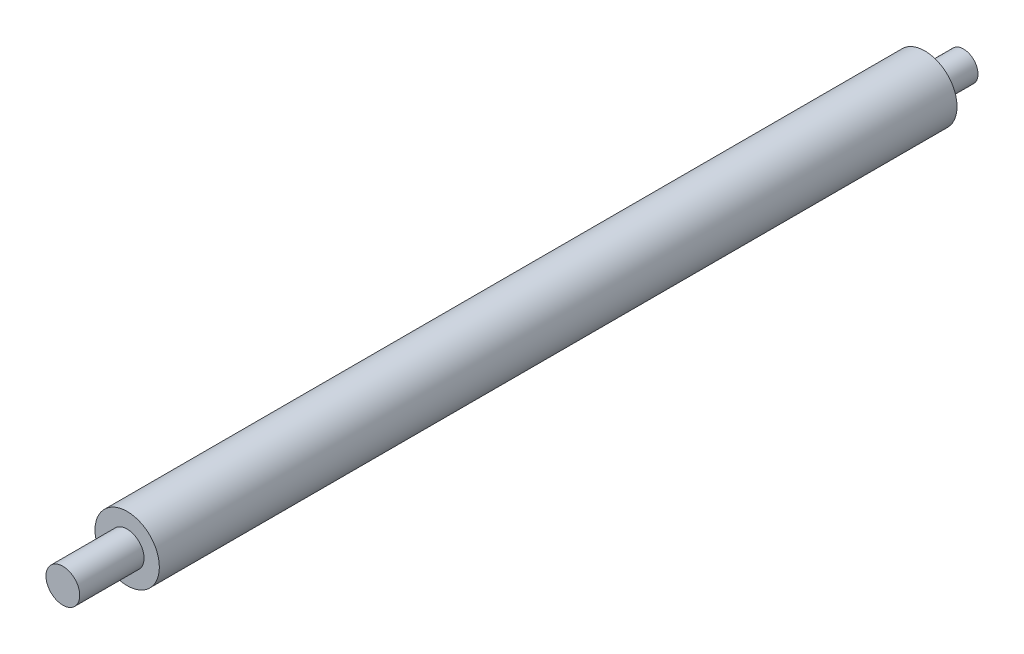
ISO-10303-21;
HEADER;
FILE_DESCRIPTION(('STEP AP214'),'2;1');
FILE_NAME('part.step','',(''),(''),'','','');
FILE_SCHEMA(('AUTOMOTIVE_DESIGN { 1 0 10303 214 1 1 1 1 }'));
ENDSEC;
DATA;
#1=APPLICATION_CONTEXT('core data for automotive mechanical design processes');
#2=APPLICATION_PROTOCOL_DEFINITION('international standard','automotive_design',2000,#1);
#3=PRODUCT_CONTEXT('',#1,'mechanical');
#4=PRODUCT('Part','Part','',(#3));
#5=PRODUCT_RELATED_PRODUCT_CATEGORY('part','',(#4));
#6=PRODUCT_DEFINITION_FORMATION('','',#4);
#7=PRODUCT_DEFINITION_CONTEXT('part definition',#1,'design');
#8=PRODUCT_DEFINITION('design','',#6,#7);
#9=PRODUCT_DEFINITION_SHAPE('','',#8);
#10=(LENGTH_UNIT() NAMED_UNIT(*) SI_UNIT(.MILLI.,.METRE.));
#11=(NAMED_UNIT(*) PLANE_ANGLE_UNIT() SI_UNIT($,.RADIAN.));
#12=(NAMED_UNIT(*) SI_UNIT($,.STERADIAN.) SOLID_ANGLE_UNIT());
#13=UNCERTAINTY_MEASURE_WITH_UNIT(LENGTH_MEASURE(1.E-05),#10,'distance_accuracy_value','');
#14=(GEOMETRIC_REPRESENTATION_CONTEXT(3) GLOBAL_UNCERTAINTY_ASSIGNED_CONTEXT((#13)) GLOBAL_UNIT_ASSIGNED_CONTEXT((#10,
#11,#12)) REPRESENTATION_CONTEXT('',''));
#15=CARTESIAN_POINT('',(0.,0.,0.));
#16=DIRECTION('',(0.,0.,1.));
#17=DIRECTION('',(1.,0.,0.));
#18=AXIS2_PLACEMENT_3D('',#15,#16,#17);
#19=CARTESIAN_POINT('',(0.,0.,700.));
#20=DIRECTION('',(0.,0.,-1.));
#21=DIRECTION('',(-1.,0.,0.));
#22=AXIS2_PLACEMENT_3D('',#19,#20,#21);
#23=CYLINDRICAL_SURFACE('',#22,25.);
#24=CARTESIAN_POINT('',(0.,0.,650.));
#25=DIRECTION('',(0.,0.,1.));
#26=DIRECTION('',(1.,0.,0.));
#27=AXIS2_PLACEMENT_3D('',#24,#25,#26);
#28=CIRCLE('',#27,25.);
#29=CARTESIAN_POINT('',(25.,0.,650.));
#30=VERTEX_POINT('',#29);
#31=EDGE_CURVE('E10',#30,#30,#28,.T.);
#32=ORIENTED_EDGE('',*,*,#31,.F.);
#33=EDGE_LOOP('',(#32));
#34=FACE_BOUND('',#33,.T.);
#35=CARTESIAN_POINT('',(0.,0.,30.));
#36=DIRECTION('',(0.,0.,-1.));
#37=DIRECTION('',(-1.,0.,0.));
#38=AXIS2_PLACEMENT_3D('',#35,#36,#37);
#39=CIRCLE('',#38,25.);
#40=CARTESIAN_POINT('',(-25.,0.,30.));
#41=VERTEX_POINT('',#40);
#42=EDGE_CURVE('E46',#41,#41,#39,.T.);
#43=ORIENTED_EDGE('',*,*,#42,.F.);
#44=EDGE_LOOP('',(#43));
#45=FACE_BOUND('',#44,.T.);
#46=ADVANCED_FACE('F31',(#34,#45),#23,.T.);
#47=CARTESIAN_POINT('',(0.,0.,650.));
#48=DIRECTION('',(0.,0.,1.));
#49=DIRECTION('',(1.,0.,0.));
#50=AXIS2_PLACEMENT_3D('',#47,#48,#49);
#51=PLANE('',#50);
#52=CARTESIAN_POINT('',(0.,0.,650.));
#53=DIRECTION('',(0.,0.,1.));
#54=DIRECTION('',(1.,0.,0.));
#55=AXIS2_PLACEMENT_3D('',#52,#53,#54);
#56=CIRCLE('',#55,13.1192405868281);
#57=CARTESIAN_POINT('',(13.1192405868281,0.,650.));
#58=VERTEX_POINT('',#57);
#59=EDGE_CURVE('E37',#58,#58,#56,.T.);
#60=ORIENTED_EDGE('',*,*,#59,.F.);
#61=EDGE_LOOP('',(#60));
#62=FACE_BOUND('',#61,.T.);
#63=ORIENTED_EDGE('',*,*,#31,.T.);
#64=EDGE_LOOP('',(#63));
#65=FACE_BOUND('',#64,.T.);
#66=ADVANCED_FACE('F68',(#62,#65),#51,.T.);
#67=CARTESIAN_POINT('',(0.,0.,650.));
#68=DIRECTION('',(0.,0.,1.));
#69=DIRECTION('',(1.,0.,0.));
#70=AXIS2_PLACEMENT_3D('',#67,#68,#69);
#71=CYLINDRICAL_SURFACE('',#70,13.1192405868281);
#72=ORIENTED_EDGE('',*,*,#59,.T.);
#73=EDGE_LOOP('',(#72));
#74=FACE_BOUND('',#73,.T.);
#75=CARTESIAN_POINT('',(0.,0.,700.));
#76=DIRECTION('',(0.,0.,1.));
#77=DIRECTION('',(1.,0.,0.));
#78=AXIS2_PLACEMENT_3D('',#75,#76,#77);
#79=CIRCLE('',#78,13.1192405868281);
#80=CARTESIAN_POINT('',(13.1192405868281,0.,700.));
#81=VERTEX_POINT('',#80);
#82=EDGE_CURVE('E41',#81,#81,#79,.T.);
#83=ORIENTED_EDGE('',*,*,#82,.F.);
#84=EDGE_LOOP('',(#83));
#85=FACE_BOUND('',#84,.T.);
#86=ADVANCED_FACE('F75',(#74,#85),#71,.T.);
#87=CARTESIAN_POINT('',(0.,0.,700.));
#88=DIRECTION('',(0.,0.,1.));
#89=DIRECTION('',(1.,0.,0.));
#90=AXIS2_PLACEMENT_3D('',#87,#88,#89);
#91=PLANE('',#90);
#92=ORIENTED_EDGE('',*,*,#82,.T.);
#93=EDGE_LOOP('',(#92));
#94=FACE_BOUND('',#93,.T.);
#95=ADVANCED_FACE('F63',(#94),#91,.T.);
#96=CARTESIAN_POINT('',(0.,0.,30.));
#97=DIRECTION('',(0.,0.,-1.));
#98=DIRECTION('',(-1.,0.,0.));
#99=AXIS2_PLACEMENT_3D('',#96,#97,#98);
#100=PLANE('',#99);
#101=CARTESIAN_POINT('',(0.,0.,30.));
#102=DIRECTION('',(0.,0.,-1.));
#103=DIRECTION('',(-1.,0.,0.));
#104=AXIS2_PLACEMENT_3D('',#101,#102,#103);
#105=CIRCLE('',#104,11.3204414187864);
#106=CARTESIAN_POINT('',(-11.3204414187864,0.,30.));
#107=VERTEX_POINT('',#106);
#108=EDGE_CURVE('E50',#107,#107,#105,.T.);
#109=ORIENTED_EDGE('',*,*,#108,.F.);
#110=EDGE_LOOP('',(#109));
#111=FACE_BOUND('',#110,.T.);
#112=ORIENTED_EDGE('',*,*,#42,.T.);
#113=EDGE_LOOP('',(#112));
#114=FACE_BOUND('',#113,.T.);
#115=ADVANCED_FACE('F60',(#111,#114),#100,.T.);
#116=CARTESIAN_POINT('',(0.,0.,30.));
#117=DIRECTION('',(0.,0.,-1.));
#118=DIRECTION('',(-1.,0.,0.));
#119=AXIS2_PLACEMENT_3D('',#116,#117,#118);
#120=CYLINDRICAL_SURFACE('',#119,11.3204414187864);
#121=ORIENTED_EDGE('',*,*,#108,.T.);
#122=EDGE_LOOP('',(#121));
#123=FACE_BOUND('',#122,.T.);
#124=CARTESIAN_POINT('',(0.,0.,0.));
#125=DIRECTION('',(0.,0.,-1.));
#126=DIRECTION('',(-1.,0.,0.));
#127=AXIS2_PLACEMENT_3D('',#124,#125,#126);
#128=CIRCLE('',#127,11.3204414187864);
#129=CARTESIAN_POINT('',(-11.3204414187864,0.,0.));
#130=VERTEX_POINT('',#129);
#131=EDGE_CURVE('E51',#130,#130,#128,.T.);
#132=ORIENTED_EDGE('',*,*,#131,.F.);
#133=EDGE_LOOP('',(#132));
#134=FACE_BOUND('',#133,.T.);
#135=ADVANCED_FACE('F57',(#123,#134),#120,.T.);
#136=CARTESIAN_POINT('',(0.,0.,0.));
#137=DIRECTION('',(0.,0.,1.));
#138=DIRECTION('',(1.,0.,0.));
#139=AXIS2_PLACEMENT_3D('',#136,#137,#138);
#140=PLANE('',#139);
#141=ORIENTED_EDGE('',*,*,#131,.T.);
#142=EDGE_LOOP('',(#141));
#143=FACE_BOUND('',#142,.T.);
#144=ADVANCED_FACE('F84',(#143),#140,.F.);
#145=CLOSED_SHELL('',(#46,#66,#86,#95,#115,#135,#144));
#146=MANIFOLD_SOLID_BREP('B2',#145);
#147=ADVANCED_BREP_SHAPE_REPRESENTATION('',(#18,#146),#14);
#148=SHAPE_DEFINITION_REPRESENTATION(#9,#147);
ENDSEC;
END-ISO-10303-21;
